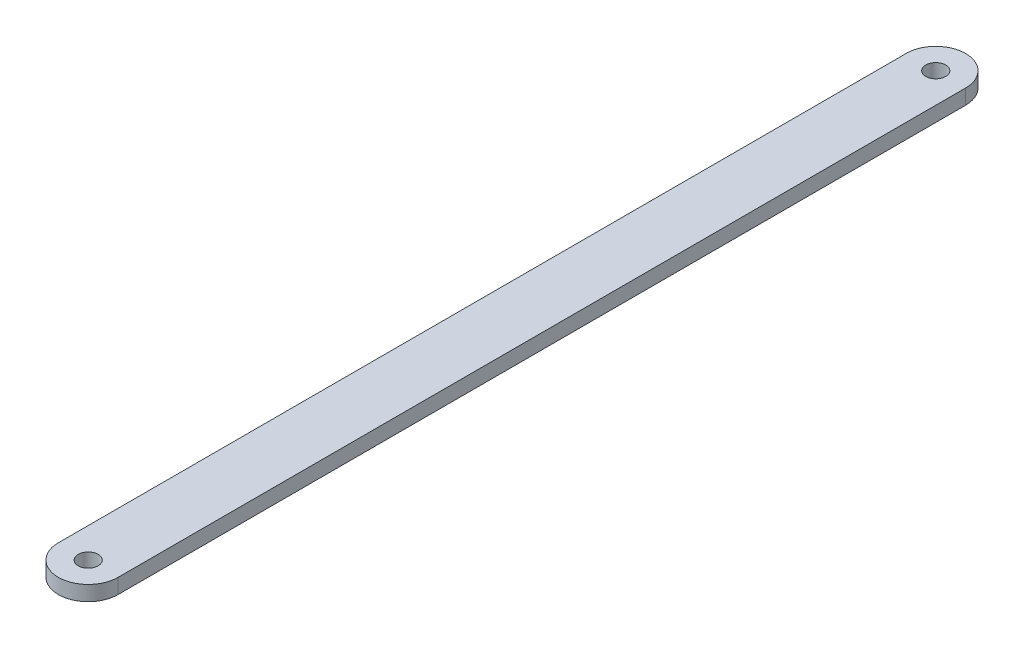
ISO-10303-21;
HEADER;
FILE_DESCRIPTION(('STEP AP214'),'2;1');
FILE_NAME('part.step','',(''),(''),'','','');
FILE_SCHEMA(('AUTOMOTIVE_DESIGN { 1 0 10303 214 1 1 1 1 }'));
ENDSEC;
DATA;
#1=APPLICATION_CONTEXT('core data for automotive mechanical design processes');
#2=APPLICATION_PROTOCOL_DEFINITION('international standard','automotive_design',2000,#1);
#3=PRODUCT_CONTEXT('',#1,'mechanical');
#4=PRODUCT('Part','Part','',(#3));
#5=PRODUCT_RELATED_PRODUCT_CATEGORY('part','',(#4));
#6=PRODUCT_DEFINITION_FORMATION('','',#4);
#7=PRODUCT_DEFINITION_CONTEXT('part definition',#1,'design');
#8=PRODUCT_DEFINITION('design','',#6,#7);
#9=PRODUCT_DEFINITION_SHAPE('','',#8);
#10=(LENGTH_UNIT() NAMED_UNIT(*) SI_UNIT(.MILLI.,.METRE.));
#11=(NAMED_UNIT(*) PLANE_ANGLE_UNIT() SI_UNIT($,.RADIAN.));
#12=(NAMED_UNIT(*) SI_UNIT($,.STERADIAN.) SOLID_ANGLE_UNIT());
#13=UNCERTAINTY_MEASURE_WITH_UNIT(LENGTH_MEASURE(1.E-05),#10,'distance_accuracy_value','');
#14=(GEOMETRIC_REPRESENTATION_CONTEXT(3) GLOBAL_UNCERTAINTY_ASSIGNED_CONTEXT((#13)) GLOBAL_UNIT_ASSIGNED_CONTEXT((#10,
#11,#12)) REPRESENTATION_CONTEXT('',''));
#15=CARTESIAN_POINT('',(0.,0.,0.));
#16=DIRECTION('',(0.,0.,1.));
#17=DIRECTION('',(1.,0.,0.));
#18=AXIS2_PLACEMENT_3D('',#15,#16,#17);
#19=CARTESIAN_POINT('',(-6.29679223422085,1.5,-0.00115585622975944));
#20=DIRECTION('',(-0.999999983152367,0.,-0.000183562704197913));
#21=DIRECTION('',(-0.000183562704197913,0.,0.999999983152367));
#22=AXIS2_PLACEMENT_3D('',#19,#20,#21);
#23=PLANE('',#22);
#24=DIRECTION('',(0.000183562704197913,0.,-0.999999983152367));
#25=VECTOR('',#24,1.);
#26=CARTESIAN_POINT('',(-6.29679223422085,-1.5,-0.00115585622975944));
#27=LINE('',#26,#25);
#28=CARTESIAN_POINT('',(-6.31238497594744,-1.5,84.9438853057112));
#29=VERTEX_POINT('',#28);
#30=CARTESIAN_POINT('',(-6.28126785717075,-1.5,-84.5737647442141));
#31=VERTEX_POINT('',#30);
#32=EDGE_CURVE('E105',#29,#31,#27,.T.);
#33=ORIENTED_EDGE('',*,*,#32,.F.);
#34=DIRECTION('',(0.,-1.,0.));
#35=VECTOR('',#34,1.);
#36=CARTESIAN_POINT('',(-6.31238497594744,1.5,84.9438853057112));
#37=LINE('',#36,#35);
#38=CARTESIAN_POINT('',(-6.31238497594744,1.5,84.9438853057112));
#39=VERTEX_POINT('',#38);
#40=EDGE_CURVE('E11',#39,#29,#37,.T.);
#41=ORIENTED_EDGE('',*,*,#40,.F.);
#42=DIRECTION('',(0.000183562704197913,0.,-0.999999983152367));
#43=VECTOR('',#42,1.);
#44=CARTESIAN_POINT('',(-6.29679223422085,1.5,-0.00115585622975944));
#45=LINE('',#44,#43);
#46=CARTESIAN_POINT('',(-6.28126785717075,1.5,-84.5737647442141));
#47=VERTEX_POINT('',#46);
#48=EDGE_CURVE('E84',#39,#47,#45,.T.);
#49=ORIENTED_EDGE('',*,*,#48,.T.);
#50=DIRECTION('',(0.,-1.,0.));
#51=VECTOR('',#50,1.);
#52=CARTESIAN_POINT('',(-6.28126785717075,1.5,-84.5737647442141));
#53=LINE('',#52,#51);
#54=EDGE_CURVE('E74',#47,#31,#53,.T.);
#55=ORIENTED_EDGE('',*,*,#54,.T.);
#56=EDGE_LOOP('',(#33,#41,#49,#55));
#57=FACE_BOUND('',#56,.T.);
#58=ADVANCED_FACE('F35',(#57),#23,.T.);
#59=CARTESIAN_POINT('',(-0.312384975947433,1.5,84.9438853057112));
#60=DIRECTION('',(0.,-1.,0.));
#61=DIRECTION('',(0.,0.,-1.));
#62=AXIS2_PLACEMENT_3D('',#59,#60,#61);
#63=CYLINDRICAL_SURFACE('',#62,5.99999999999999);
#64=CARTESIAN_POINT('',(-0.312384975947433,-1.5,84.9438853057112));
#65=DIRECTION('',(0.,1.,0.));
#66=DIRECTION('',(0.,0.,1.));
#67=AXIS2_PLACEMENT_3D('',#64,#65,#66);
#68=CIRCLE('',#67,5.99999999999999);
#69=CARTESIAN_POINT('',(5.68761502405254,-1.5,84.9438853057112));
#70=VERTEX_POINT('',#69);
#71=EDGE_CURVE('E90',#29,#70,#68,.T.);
#72=ORIENTED_EDGE('',*,*,#71,.T.);
#73=DIRECTION('',(0.,-1.,0.));
#74=VECTOR('',#73,1.);
#75=CARTESIAN_POINT('',(5.68761502405254,1.5,84.9438853057112));
#76=LINE('',#75,#74);
#77=CARTESIAN_POINT('',(5.68761502405254,1.5,84.9438853057112));
#78=VERTEX_POINT('',#77);
#79=EDGE_CURVE('E44',#78,#70,#76,.T.);
#80=ORIENTED_EDGE('',*,*,#79,.F.);
#81=CARTESIAN_POINT('',(-0.312384975947433,1.5,84.9438853057112));
#82=DIRECTION('',(0.,1.,0.));
#83=DIRECTION('',(0.,0.,1.));
#84=AXIS2_PLACEMENT_3D('',#81,#82,#83);
#85=CIRCLE('',#84,5.99999999999999);
#86=EDGE_CURVE('E79',#39,#78,#85,.T.);
#87=ORIENTED_EDGE('',*,*,#86,.F.);
#88=ORIENTED_EDGE('',*,*,#40,.T.);
#89=EDGE_LOOP('',(#72,#80,#87,#88));
#90=FACE_BOUND('',#89,.T.);
#91=ADVANCED_FACE('F88',(#90),#63,.T.);
#92=CARTESIAN_POINT('',(5.68761502405256,1.5,0.));
#93=DIRECTION('',(1.,0.,0.));
#94=DIRECTION('',(0.,0.,-1.));
#95=AXIS2_PLACEMENT_3D('',#92,#93,#94);
#96=PLANE('',#95);
#97=DIRECTION('',(0.,0.,1.));
#98=VECTOR('',#97,1.);
#99=CARTESIAN_POINT('',(5.68761502405256,-1.5,0.));
#100=LINE('',#99,#98);
#101=CARTESIAN_POINT('',(5.68761502405257,-1.5,-85.1840410342988));
#102=VERTEX_POINT('',#101);
#103=EDGE_CURVE('E109',#102,#70,#100,.T.);
#104=ORIENTED_EDGE('',*,*,#103,.F.);
#105=DIRECTION('',(0.,-1.,0.));
#106=VECTOR('',#105,1.);
#107=CARTESIAN_POINT('',(5.68761502405257,1.5,-85.1840410342988));
#108=LINE('',#107,#106);
#109=CARTESIAN_POINT('',(5.68761502405257,1.5,-85.1840410342988));
#110=VERTEX_POINT('',#109);
#111=EDGE_CURVE('E67',#110,#102,#108,.T.);
#112=ORIENTED_EDGE('',*,*,#111,.F.);
#113=DIRECTION('',(0.,0.,1.));
#114=VECTOR('',#113,1.);
#115=CARTESIAN_POINT('',(5.68761502405256,1.5,0.));
#116=LINE('',#115,#114);
#117=EDGE_CURVE('E83',#110,#78,#116,.T.);
#118=ORIENTED_EDGE('',*,*,#117,.T.);
#119=ORIENTED_EDGE('',*,*,#79,.T.);
#120=EDGE_LOOP('',(#104,#112,#118,#119));
#121=FACE_BOUND('',#120,.T.);
#122=ADVANCED_FACE('F94',(#121),#96,.T.);
#123=CARTESIAN_POINT('',(-0.312384975947433,1.5,84.9438853057112));
#124=DIRECTION('',(0.,-1.,0.));
#125=DIRECTION('',(0.,0.,-1.));
#126=AXIS2_PLACEMENT_3D('',#123,#124,#125);
#127=CYLINDRICAL_SURFACE('',#126,2.);
#128=CARTESIAN_POINT('',(-0.312384975947433,1.5,84.9438853057112));
#129=DIRECTION('',(0.,1.,0.));
#130=DIRECTION('',(0.,0.,1.));
#131=AXIS2_PLACEMENT_3D('',#128,#129,#130);
#132=CIRCLE('',#131,2.);
#133=CARTESIAN_POINT('',(-0.312384975947433,1.5,86.9438853057112));
#134=VERTEX_POINT('',#133);
#135=EDGE_CURVE('E116',#134,#134,#132,.T.);
#136=ORIENTED_EDGE('',*,*,#135,.T.);
#137=EDGE_LOOP('',(#136));
#138=FACE_BOUND('',#137,.T.);
#139=CARTESIAN_POINT('',(-0.312384975947433,-1.5,84.9438853057112));
#140=DIRECTION('',(0.,1.,0.));
#141=DIRECTION('',(0.,0.,1.));
#142=AXIS2_PLACEMENT_3D('',#139,#140,#141);
#143=CIRCLE('',#142,2.);
#144=CARTESIAN_POINT('',(-0.312384975947433,-1.5,86.9438853057112));
#145=VERTEX_POINT('',#144);
#146=EDGE_CURVE('E102',#145,#145,#143,.T.);
#147=ORIENTED_EDGE('',*,*,#146,.F.);
#148=EDGE_LOOP('',(#147));
#149=FACE_BOUND('',#148,.T.);
#150=ADVANCED_FACE('F129',(#138,#149),#127,.F.);
#151=CARTESIAN_POINT('',(-0.312384975947211,1.5,-85.1840410342988));
#152=DIRECTION('',(0.,-1.,0.));
#153=DIRECTION('',(0.,0.,-1.));
#154=AXIS2_PLACEMENT_3D('',#151,#152,#153);
#155=CYLINDRICAL_SURFACE('',#154,2.);
#156=CARTESIAN_POINT('',(-0.312384975947211,1.5,-85.1840410342988));
#157=DIRECTION('',(0.,1.,0.));
#158=DIRECTION('',(0.,0.,1.));
#159=AXIS2_PLACEMENT_3D('',#156,#157,#158);
#160=CIRCLE('',#159,2.);
#161=CARTESIAN_POINT('',(-0.312384975947211,1.5,-83.1840410342988));
#162=VERTEX_POINT('',#161);
#163=EDGE_CURVE('E113',#162,#162,#160,.T.);
#164=ORIENTED_EDGE('',*,*,#163,.T.);
#165=EDGE_LOOP('',(#164));
#166=FACE_BOUND('',#165,.T.);
#167=CARTESIAN_POINT('',(-0.312384975947211,-1.5,-85.1840410342988));
#168=DIRECTION('',(0.,1.,0.));
#169=DIRECTION('',(0.,0.,1.));
#170=AXIS2_PLACEMENT_3D('',#167,#168,#169);
#171=CIRCLE('',#170,2.);
#172=CARTESIAN_POINT('',(-0.312384975947211,-1.5,-83.1840410342988));
#173=VERTEX_POINT('',#172);
#174=EDGE_CURVE('E99',#173,#173,#171,.T.);
#175=ORIENTED_EDGE('',*,*,#174,.F.);
#176=EDGE_LOOP('',(#175));
#177=FACE_BOUND('',#176,.T.);
#178=ADVANCED_FACE('F37',(#166,#177),#155,.F.);
#179=CARTESIAN_POINT('',(-0.312384975947211,1.5,-85.1840410342988));
#180=DIRECTION('',(0.,-1.,0.));
#181=DIRECTION('',(0.,0.,-1.));
#182=AXIS2_PLACEMENT_3D('',#179,#180,#181);
#183=CYLINDRICAL_SURFACE('',#182,6.00000000000001);
#184=CARTESIAN_POINT('',(-0.312384975947211,-1.5,-85.1840410342988));
#185=DIRECTION('',(0.,1.,0.));
#186=DIRECTION('',(0.,0.,1.));
#187=AXIS2_PLACEMENT_3D('',#184,#185,#186);
#188=CIRCLE('',#187,6.00000000000001);
#189=EDGE_CURVE('E111',#102,#31,#188,.T.);
#190=ORIENTED_EDGE('',*,*,#189,.T.);
#191=ORIENTED_EDGE('',*,*,#54,.F.);
#192=CARTESIAN_POINT('',(-0.312384975947211,1.5,-85.1840410342988));
#193=DIRECTION('',(0.,1.,0.));
#194=DIRECTION('',(0.,0.,1.));
#195=AXIS2_PLACEMENT_3D('',#192,#193,#194);
#196=CIRCLE('',#195,6.00000000000001);
#197=EDGE_CURVE('E52',#110,#47,#196,.T.);
#198=ORIENTED_EDGE('',*,*,#197,.F.);
#199=ORIENTED_EDGE('',*,*,#111,.T.);
#200=EDGE_LOOP('',(#190,#191,#198,#199));
#201=FACE_BOUND('',#200,.T.);
#202=ADVANCED_FACE('F136',(#201),#183,.T.);
#203=CARTESIAN_POINT('',(0.,1.5,0.));
#204=DIRECTION('',(0.,1.,0.));
#205=DIRECTION('',(0.,0.,1.));
#206=AXIS2_PLACEMENT_3D('',#203,#204,#205);
#207=PLANE('',#206);
#208=ORIENTED_EDGE('',*,*,#163,.F.);
#209=EDGE_LOOP('',(#208));
#210=FACE_BOUND('',#209,.T.);
#211=ORIENTED_EDGE('',*,*,#135,.F.);
#212=EDGE_LOOP('',(#211));
#213=FACE_BOUND('',#212,.T.);
#214=ORIENTED_EDGE('',*,*,#48,.F.);
#215=ORIENTED_EDGE('',*,*,#86,.T.);
#216=ORIENTED_EDGE('',*,*,#117,.F.);
#217=ORIENTED_EDGE('',*,*,#197,.T.);
#218=EDGE_LOOP('',(#214,#215,#216,#217));
#219=FACE_BOUND('',#218,.T.);
#220=ADVANCED_FACE('F81',(#210,#213,#219),#207,.T.);
#221=CARTESIAN_POINT('',(0.,-1.5,0.));
#222=DIRECTION('',(0.,1.,0.));
#223=DIRECTION('',(0.,0.,1.));
#224=AXIS2_PLACEMENT_3D('',#221,#222,#223);
#225=PLANE('',#224);
#226=ORIENTED_EDGE('',*,*,#174,.T.);
#227=EDGE_LOOP('',(#226));
#228=FACE_BOUND('',#227,.T.);
#229=ORIENTED_EDGE('',*,*,#146,.T.);
#230=EDGE_LOOP('',(#229));
#231=FACE_BOUND('',#230,.T.);
#232=ORIENTED_EDGE('',*,*,#32,.T.);
#233=ORIENTED_EDGE('',*,*,#189,.F.);
#234=ORIENTED_EDGE('',*,*,#103,.T.);
#235=ORIENTED_EDGE('',*,*,#71,.F.);
#236=EDGE_LOOP('',(#232,#233,#234,#235));
#237=FACE_BOUND('',#236,.T.);
#238=ADVANCED_FACE('F141',(#228,#231,#237),#225,.F.);
#239=CLOSED_SHELL('',(#58,#91,#122,#150,#178,#202,#220,#238));
#240=MANIFOLD_SOLID_BREP('B2',#239);
#241=ADVANCED_BREP_SHAPE_REPRESENTATION('',(#18,#240),#14);
#242=SHAPE_DEFINITION_REPRESENTATION(#9,#241);
ENDSEC;
END-ISO-10303-21;
